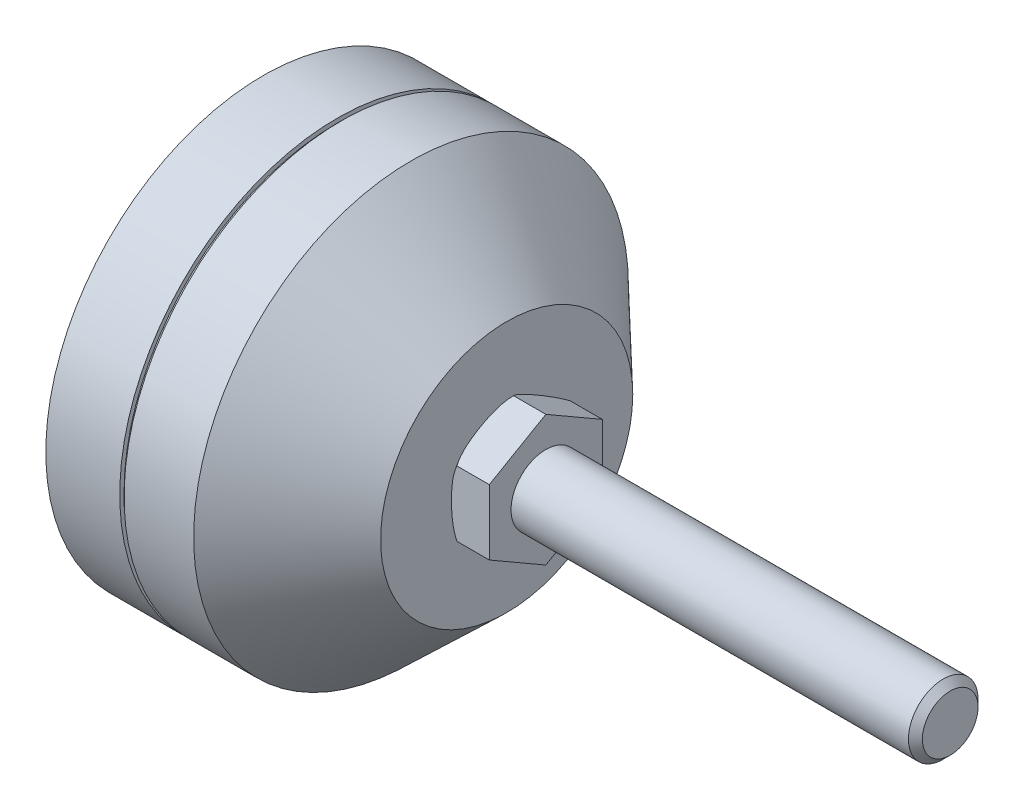
ISO-10303-21;
HEADER;
FILE_DESCRIPTION(('STEP AP214'),'2;1');
FILE_NAME('part.step','',(''),(''),'','','');
FILE_SCHEMA(('AUTOMOTIVE_DESIGN { 1 0 10303 214 1 1 1 1 }'));
ENDSEC;
DATA;
#1=APPLICATION_CONTEXT('core data for automotive mechanical design processes');
#2=APPLICATION_PROTOCOL_DEFINITION('international standard','automotive_design',2000,#1);
#3=PRODUCT_CONTEXT('',#1,'mechanical');
#4=PRODUCT('Part','Part','',(#3));
#5=PRODUCT_RELATED_PRODUCT_CATEGORY('part','',(#4));
#6=PRODUCT_DEFINITION_FORMATION('','',#4);
#7=PRODUCT_DEFINITION_CONTEXT('part definition',#1,'design');
#8=PRODUCT_DEFINITION('design','',#6,#7);
#9=PRODUCT_DEFINITION_SHAPE('','',#8);
#10=(LENGTH_UNIT() NAMED_UNIT(*) SI_UNIT(.MILLI.,.METRE.));
#11=(NAMED_UNIT(*) PLANE_ANGLE_UNIT() SI_UNIT($,.RADIAN.));
#12=(NAMED_UNIT(*) SI_UNIT($,.STERADIAN.) SOLID_ANGLE_UNIT());
#13=UNCERTAINTY_MEASURE_WITH_UNIT(LENGTH_MEASURE(1.E-05),#10,'distance_accuracy_value','');
#14=(GEOMETRIC_REPRESENTATION_CONTEXT(3) GLOBAL_UNCERTAINTY_ASSIGNED_CONTEXT((#13)) GLOBAL_UNIT_ASSIGNED_CONTEXT((#10,
#11,#12)) REPRESENTATION_CONTEXT('',''));
#15=CARTESIAN_POINT('',(0.,0.,0.));
#16=DIRECTION('',(0.,0.,1.));
#17=DIRECTION('',(1.,0.,0.));
#18=AXIS2_PLACEMENT_3D('',#15,#16,#17);
#19=CARTESIAN_POINT('',(82.5,0.,0.));
#20=DIRECTION('',(1.,0.,0.));
#21=DIRECTION('',(0.,0.,-1.));
#22=AXIS2_PLACEMENT_3D('',#19,#20,#21);
#23=CYLINDRICAL_SURFACE('',#22,4.);
#24=CARTESIAN_POINT('',(78.2,0.,0.));
#25=DIRECTION('',(1.,0.,0.));
#26=DIRECTION('',(0.,0.,-1.));
#27=AXIS2_PLACEMENT_3D('',#24,#25,#26);
#28=CIRCLE('',#27,4.);
#29=CARTESIAN_POINT('',(78.2,0.,-4.));
#30=VERTEX_POINT('',#29);
#31=EDGE_CURVE('E11',#30,#30,#28,.F.);
#32=ORIENTED_EDGE('',*,*,#31,.T.);
#33=EDGE_LOOP('',(#32));
#34=FACE_BOUND('',#33,.T.);
#35=CARTESIAN_POINT('',(32.5,0.,0.));
#36=DIRECTION('',(1.,0.,0.));
#37=DIRECTION('',(0.,0.,-1.));
#38=AXIS2_PLACEMENT_3D('',#35,#36,#37);
#39=CIRCLE('',#38,4.);
#40=CARTESIAN_POINT('',(32.5,0.,-4.));
#41=VERTEX_POINT('',#40);
#42=EDGE_CURVE('E279',#41,#41,#39,.T.);
#43=ORIENTED_EDGE('',*,*,#42,.T.);
#44=EDGE_LOOP('',(#43));
#45=FACE_BOUND('',#44,.T.);
#46=ADVANCED_FACE('F40',(#34,#45),#23,.T.);
#47=CARTESIAN_POINT('',(0.,0.,0.));
#48=DIRECTION('',(1.,0.,0.));
#49=DIRECTION('',(0.,0.,-1.));
#50=AXIS2_PLACEMENT_3D('',#47,#48,#49);
#51=PLANE('',#50);
#52=CARTESIAN_POINT('',(0.,0.,0.));
#53=DIRECTION('',(1.,0.,0.));
#54=DIRECTION('',(0.,0.,-1.));
#55=AXIS2_PLACEMENT_3D('',#52,#53,#54);
#56=CIRCLE('',#55,25.);
#57=CARTESIAN_POINT('',(0.,0.,-25.));
#58=VERTEX_POINT('',#57);
#59=EDGE_CURVE('E335',#58,#58,#56,.T.);
#60=ORIENTED_EDGE('',*,*,#59,.F.);
#61=EDGE_LOOP('',(#60));
#62=FACE_BOUND('',#61,.T.);
#63=ADVANCED_FACE('F267',(#62),#51,.F.);
#64=CARTESIAN_POINT('',(82.5,0.,0.));
#65=DIRECTION('',(1.,0.,0.));
#66=DIRECTION('',(0.,0.,-1.));
#67=AXIS2_PLACEMENT_3D('',#64,#65,#66);
#68=CYLINDRICAL_SURFACE('',#67,25.);
#69=CARTESIAN_POINT('',(8.5,0.,0.));
#70=DIRECTION('',(1.,0.,0.));
#71=DIRECTION('',(0.,0.,-1.));
#72=AXIS2_PLACEMENT_3D('',#69,#70,#71);
#73=CIRCLE('',#72,25.);
#74=CARTESIAN_POINT('',(8.5,0.,-25.));
#75=VERTEX_POINT('',#74);
#76=EDGE_CURVE('E332',#75,#75,#73,.T.);
#77=ORIENTED_EDGE('',*,*,#76,.F.);
#78=EDGE_LOOP('',(#77));
#79=FACE_BOUND('',#78,.T.);
#80=ORIENTED_EDGE('',*,*,#59,.T.);
#81=EDGE_LOOP('',(#80));
#82=FACE_BOUND('',#81,.T.);
#83=ADVANCED_FACE('F272',(#79,#82),#68,.T.);
#84=CARTESIAN_POINT('',(8.5,25.,0.));
#85=DIRECTION('',(-1.,0.,0.));
#86=DIRECTION('',(0.,0.,1.));
#87=AXIS2_PLACEMENT_3D('',#84,#85,#86);
#88=PLANE('',#87);
#89=CARTESIAN_POINT('',(8.5,0.,0.));
#90=DIRECTION('',(1.,0.,0.));
#91=DIRECTION('',(0.,0.,-1.));
#92=AXIS2_PLACEMENT_3D('',#89,#90,#91);
#93=CIRCLE('',#92,24.5);
#94=CARTESIAN_POINT('',(8.5,0.,-24.5));
#95=VERTEX_POINT('',#94);
#96=EDGE_CURVE('E327',#95,#95,#93,.T.);
#97=ORIENTED_EDGE('',*,*,#96,.F.);
#98=EDGE_LOOP('',(#97));
#99=FACE_BOUND('',#98,.T.);
#100=ORIENTED_EDGE('',*,*,#76,.T.);
#101=EDGE_LOOP('',(#100));
#102=FACE_BOUND('',#101,.T.);
#103=ADVANCED_FACE('F298',(#99,#102),#88,.F.);
#104=CARTESIAN_POINT('',(8.5,0.,0.));
#105=DIRECTION('',(1.,0.,0.));
#106=DIRECTION('',(0.,0.,-1.));
#107=AXIS2_PLACEMENT_3D('',#104,#105,#106);
#108=CONICAL_SURFACE('',#107,24.5,0.785398163397448);
#109=CARTESIAN_POINT('',(9.,0.,0.));
#110=DIRECTION('',(1.,0.,0.));
#111=DIRECTION('',(0.,0.,-1.));
#112=AXIS2_PLACEMENT_3D('',#109,#110,#111);
#113=CIRCLE('',#112,25.);
#114=CARTESIAN_POINT('',(9.,0.,-25.));
#115=VERTEX_POINT('',#114);
#116=EDGE_CURVE('E324',#115,#115,#113,.T.);
#117=ORIENTED_EDGE('',*,*,#116,.F.);
#118=EDGE_LOOP('',(#117));
#119=FACE_BOUND('',#118,.T.);
#120=ORIENTED_EDGE('',*,*,#96,.T.);
#121=EDGE_LOOP('',(#120));
#122=FACE_BOUND('',#121,.T.);
#123=ADVANCED_FACE('F302',(#119,#122),#108,.T.);
#124=CARTESIAN_POINT('',(82.5,0.,0.));
#125=DIRECTION('',(1.,0.,0.));
#126=DIRECTION('',(0.,0.,-1.));
#127=AXIS2_PLACEMENT_3D('',#124,#125,#126);
#128=CYLINDRICAL_SURFACE('',#127,25.);
#129=CARTESIAN_POINT('',(17.,0.,0.));
#130=DIRECTION('',(1.,0.,0.));
#131=DIRECTION('',(0.,0.,-1.));
#132=AXIS2_PLACEMENT_3D('',#129,#130,#131);
#133=CIRCLE('',#132,25.);
#134=CARTESIAN_POINT('',(17.,0.,-25.));
#135=VERTEX_POINT('',#134);
#136=EDGE_CURVE('E323',#135,#135,#133,.T.);
#137=ORIENTED_EDGE('',*,*,#136,.F.);
#138=EDGE_LOOP('',(#137));
#139=FACE_BOUND('',#138,.T.);
#140=ORIENTED_EDGE('',*,*,#116,.T.);
#141=EDGE_LOOP('',(#140));
#142=FACE_BOUND('',#141,.T.);
#143=ADVANCED_FACE('F306',(#139,#142),#128,.T.);
#144=CARTESIAN_POINT('',(17.,0.,0.));
#145=DIRECTION('',(-1.,0.,0.));
#146=DIRECTION('',(0.,0.,1.));
#147=AXIS2_PLACEMENT_3D('',#144,#145,#146);
#148=CONICAL_SURFACE('',#147,25.,0.762146540586986);
#149=CARTESIAN_POINT('',(28.,0.,0.));
#150=DIRECTION('',(1.,0.,0.));
#151=DIRECTION('',(0.,0.,-1.));
#152=AXIS2_PLACEMENT_3D('',#149,#150,#151);
#153=CIRCLE('',#152,14.5);
#154=CARTESIAN_POINT('',(28.,0.,-14.5));
#155=VERTEX_POINT('',#154);
#156=EDGE_CURVE('E320',#155,#155,#153,.T.);
#157=ORIENTED_EDGE('',*,*,#156,.F.);
#158=EDGE_LOOP('',(#157));
#159=FACE_BOUND('',#158,.T.);
#160=ORIENTED_EDGE('',*,*,#136,.T.);
#161=EDGE_LOOP('',(#160));
#162=FACE_BOUND('',#161,.T.);
#163=ADVANCED_FACE('F309',(#159,#162),#148,.T.);
#164=CARTESIAN_POINT('',(28.,14.5,0.));
#165=DIRECTION('',(-1.,0.,0.));
#166=DIRECTION('',(0.,0.,1.));
#167=AXIS2_PLACEMENT_3D('',#164,#165,#166);
#168=PLANE('',#167);
#169=ORIENTED_EDGE('',*,*,#156,.T.);
#170=EDGE_LOOP('',(#169));
#171=FACE_BOUND('',#170,.T.);
#172=CARTESIAN_POINT('',(28.,0.,0.));
#173=DIRECTION('',(1.,0.,0.));
#174=DIRECTION('',(0.,0.,-1.));
#175=AXIS2_PLACEMENT_3D('',#172,#173,#174);
#176=CIRCLE('',#175,5.60555349946541);
#177=CARTESIAN_POINT('',(28.,0.,-5.60555349946541));
#178=VERTEX_POINT('',#177);
#179=EDGE_CURVE('E125',#178,#178,#176,.T.);
#180=ORIENTED_EDGE('',*,*,#179,.F.);
#181=EDGE_LOOP('',(#180));
#182=FACE_BOUND('',#181,.T.);
#183=ADVANCED_FACE('F142',(#171,#182),#168,.F.);
#184=CARTESIAN_POINT('',(30.7,0.,0.));
#185=DIRECTION('',(1.,0.,0.));
#186=DIRECTION('',(0.,0.,-1.));
#187=AXIS2_PLACEMENT_3D('',#184,#185,#186);
#188=TOROIDAL_SURFACE('',#187,5.60555349946541,2.69999999999974);
#189=CARTESIAN_POINT('',(28.7816674450426,3.75277685951686,6.5));
#190=CARTESIAN_POINT('',(28.7613545278986,3.71175904029286,6.5));
#191=CARTESIAN_POINT('',(28.7417539007523,3.67035741039875,6.5));
#192=CARTESIAN_POINT('',(28.7039915048998,3.58705736290951,6.5));
#193=CARTESIAN_POINT('',(28.6858352829872,3.54517733250758,6.5));
#194=CARTESIAN_POINT('',(28.63327929734,3.41860983722914,6.5));
#195=CARTESIAN_POINT('',(28.600971803585,3.33346306761934,6.5));
#196=CARTESIAN_POINT('',(28.5105655211857,3.07403120749082,6.5));
#197=CARTESIAN_POINT('',(28.4595937961399,2.89732223239918,6.5));
#198=CARTESIAN_POINT('',(28.3079349733705,2.27414781575982,6.5));
#199=CARTESIAN_POINT('',(28.2458895561874,1.82220529830996,6.5));
#200=CARTESIAN_POINT('',(28.1679872087156,0.911927722176328,6.5));
#201=CARTESIAN_POINT('',(28.1524589389609,0.457069886751857,6.5));
#202=CARTESIAN_POINT('',(28.1524589389609,-0.458499142986258,6.5));
#203=CARTESIAN_POINT('',(28.1681578360931,-0.917399136468803,6.5));
#204=CARTESIAN_POINT('',(28.2471269494985,-1.8331236365492,6.5));
#205=CARTESIAN_POINT('',(28.3098223557404,-2.28677187643626,6.5));
#206=CARTESIAN_POINT('',(28.5036410563009,-3.07447273530205,6.5));
#207=CARTESIAN_POINT('',(28.6137512031566,-3.40655164008468,6.5));
#208=CARTESIAN_POINT('',(28.7717046695275,-3.73254867409801,6.5));
#209=CARTESIAN_POINT('',(28.7766634533395,-3.74267231816483,6.5));
#210=CARTESIAN_POINT('',(28.7816678323669,-3.75277764164144,6.5));
#211=B_SPLINE_CURVE_WITH_KNOTS('',3,(#189,#190,#191,#192,#193,#194,#195,#196,#197,#198,#199,
#200,#201,#202,#203,#204,#205,#206,#207,#208,#209,#210),.UNSPECIFIED.,.F.,.F.,(4,2,2,2,2,2,2,2,
2,2,4),(21.4653656359153,21.6026109807731,21.7398563256309,22.0143470153464,22.5633283947775,
23.9330925625883,25.302856730399,26.6769041468622,28.0509515633255,29.091452340955,
29.1248943163273),.UNSPECIFIED.);
#212=CARTESIAN_POINT('',(28.7816673906747,3.7527767497326,6.5));
#213=VERTEX_POINT('',#212);
#214=CARTESIAN_POINT('',(28.781667390669,-3.75277674973837,6.49999999999001));
#215=VERTEX_POINT('',#214);
#216=EDGE_CURVE('E106',#213,#215,#211,.T.);
#217=ORIENTED_EDGE('',*,*,#216,.F.);
#218=CARTESIAN_POINT('',(28.7816673906303,7.50555349942004,7.80483840869606E-11));
#219=CARTESIAN_POINT('',(28.6500000242734,7.37261570863953,0.230255007955859));
#220=CARTESIAN_POINT('',(28.5495394527387,7.23367972610888,0.470899188698446));
#221=CARTESIAN_POINT('',(28.3899088735364,6.94854209425677,0.964772054216187));
#222=CARTESIAN_POINT('',(28.3317245218498,6.80386007270674,1.21536866648261));
#223=CARTESIAN_POINT('',(28.2272841292935,6.45942405400656,1.81194935082807));
#224=CARTESIAN_POINT('',(28.192842401115,6.25912814591938,2.15887204018323));
#225=CARTESIAN_POINT('',(28.1534269828326,5.86070667979887,2.84895826233005));
#226=CARTESIAN_POINT('',(28.1482810226136,5.66319688036159,3.19105526994816));
#227=CARTESIAN_POINT('',(28.1625000688476,5.26642124330331,3.87829083253862));
#228=CARTESIAN_POINT('',(28.1816910205527,5.06977429845133,4.21889333217546));
#229=CARTESIAN_POINT('',(28.2595232654608,4.67240021666049,4.90716543144823));
#230=CARTESIAN_POINT('',(28.317917633634,4.47367769709478,5.25136293194416));
#231=CARTESIAN_POINT('',(28.4993513221206,4.0969731461065,5.90383435369829));
#232=CARTESIAN_POINT('',(28.6159334847767,3.92010977929166,6.21017069101929));
#233=CARTESIAN_POINT('',(28.7816673906609,3.75277674974683,6.49999999997536));
#234=B_SPLINE_CURVE_WITH_KNOTS('',3,(#218,#219,#220,#221,#222,#223,#224,#225,#226,#227,#228,
#229,#230,#231,#232,#233),.UNSPECIFIED.,.F.,.F.,(4,2,2,2,2,2,2,4),(0.000253721511004251,
0.88333285403746,1.76641198656391,2.96517631044045,4.16394063431699,5.36270495819352,
6.56146928207006,7.66229512899537),.UNSPECIFIED.);
#235=CARTESIAN_POINT('',(28.7816673906747,7.5055534994651,0.));
#236=VERTEX_POINT('',#235);
#237=EDGE_CURVE('E93',#236,#213,#234,.T.);
#238=ORIENTED_EDGE('',*,*,#237,.F.);
#239=CARTESIAN_POINT('',(28.7816673906294,3.75277674977863,-6.49999999992027));
#240=CARTESIAN_POINT('',(28.6500000242727,3.88571454055912,-6.2697449920425));
#241=CARTESIAN_POINT('',(28.5495394527382,4.02465052308972,-6.0291008113));
#242=CARTESIAN_POINT('',(28.389908873536,4.30978815494173,-5.53522794578243));
#243=CARTESIAN_POINT('',(28.3317245218495,4.4544701764917,-5.2846313335161));
#244=CARTESIAN_POINT('',(28.2272841292934,4.79890619519181,-4.68805064917076));
#245=CARTESIAN_POINT('',(28.1928424011149,4.99920210327898,-4.34112795981564));
#246=CARTESIAN_POINT('',(28.1534269828325,5.39762356939945,-3.65104173766888));
#247=CARTESIAN_POINT('',(28.1482810226136,5.59513336883671,-3.3089447300508));
#248=CARTESIAN_POINT('',(28.1625000688476,5.99190900589495,-2.6217091674604));
#249=CARTESIAN_POINT('',(28.1816910205527,6.18855595074692,-2.2811066678236));
#250=CARTESIAN_POINT('',(28.2595232654609,6.58593003253772,-1.59283456855088));
#251=CARTESIAN_POINT('',(28.3179176336341,6.78465255210341,-1.248637068055));
#252=CARTESIAN_POINT('',(28.4993513221208,7.16135710309151,-0.59616564630118));
#253=CARTESIAN_POINT('',(28.6159334847768,7.33822046990619,-0.289829308980458));
#254=CARTESIAN_POINT('',(28.7816673906609,7.50555349945088,-2.46313386353947E-11));
#255=B_SPLINE_CURVE_WITH_KNOTS('',3,(#239,#240,#241,#242,#243,#244,#245,#246,#247,#248,#249,
#250,#251,#252,#253,#254),.UNSPECIFIED.,.F.,.F.,(4,2,2,2,2,2,2,4),(0.000253721512318145,
0.883332854038403,1.76641198656449,2.96517631044091,4.16394063431733,5.36270495819375,
6.56146928207017,7.66229512899453),.UNSPECIFIED.);
#256=CARTESIAN_POINT('',(28.7816673906671,3.7527767497326,-6.5));
#257=VERTEX_POINT('',#256);
#258=EDGE_CURVE('E105',#257,#236,#255,.T.);
#259=ORIENTED_EDGE('',*,*,#258,.F.);
#260=CARTESIAN_POINT('',(28.7816674450426,-3.75277685951685,-6.5));
#261=CARTESIAN_POINT('',(28.7613545278986,-3.71175904029286,-6.5));
#262=CARTESIAN_POINT('',(28.7417539007523,-3.67035741039874,-6.5));
#263=CARTESIAN_POINT('',(28.7039915048998,-3.5870573629095,-6.5));
#264=CARTESIAN_POINT('',(28.6858352829872,-3.54517733250758,-6.5));
#265=CARTESIAN_POINT('',(28.63327929734,-3.41860983722914,-6.5));
#266=CARTESIAN_POINT('',(28.600971803585,-3.33346306761933,-6.5));
#267=CARTESIAN_POINT('',(28.5105655211857,-3.07403120749082,-6.5));
#268=CARTESIAN_POINT('',(28.4595937961399,-2.89732223239918,-6.5));
#269=CARTESIAN_POINT('',(28.3079349733705,-2.27414781575982,-6.5));
#270=CARTESIAN_POINT('',(28.2458895561874,-1.82220529830995,-6.5));
#271=CARTESIAN_POINT('',(28.1679872087156,-0.911927722176327,-6.5));
#272=CARTESIAN_POINT('',(28.1524589389609,-0.457069886751856,-6.5));
#273=CARTESIAN_POINT('',(28.1524589389609,0.45849914298626,-6.5));
#274=CARTESIAN_POINT('',(28.1681578360931,0.917399136468807,-6.5));
#275=CARTESIAN_POINT('',(28.2471269494985,1.8331236365492,-6.5));
#276=CARTESIAN_POINT('',(28.3098223557404,2.28677187643626,-6.5));
#277=CARTESIAN_POINT('',(28.5036410563009,3.07447273530205,-6.5));
#278=CARTESIAN_POINT('',(28.6137512031566,3.40655164008466,-6.5));
#279=CARTESIAN_POINT('',(28.7717046695267,3.73254867409625,-6.5));
#280=CARTESIAN_POINT('',(28.7766634533378,3.74267231816131,-6.5));
#281=CARTESIAN_POINT('',(28.7816678323643,3.75277764163617,-6.5));
#282=B_SPLINE_CURVE_WITH_KNOTS('',3,(#260,#261,#262,#263,#264,#265,#266,#267,#268,#269,#270,
#271,#272,#273,#274,#275,#276,#277,#278,#279,#280,#281),.UNSPECIFIED.,.F.,.F.,(4,2,2,2,2,2,2,2,
2,2,4),(21.4653656359153,21.6026109807731,21.7398563256309,22.0143470153464,22.5633283947775,
23.9330925625882,25.302856730399,26.6769041468622,28.0509515633254,29.0914523409549,
29.1248943163214),.UNSPECIFIED.);
#283=CARTESIAN_POINT('',(28.7816673906747,-3.7527767497326,-6.5));
#284=VERTEX_POINT('',#283);
#285=EDGE_CURVE('E172',#284,#257,#282,.T.);
#286=ORIENTED_EDGE('',*,*,#285,.F.);
#287=CARTESIAN_POINT('',(28.7816673906303,-7.50555349942004,-7.8048175453727E-11));
#288=CARTESIAN_POINT('',(28.6500000242734,-7.37261570863953,-0.230255007955857));
#289=CARTESIAN_POINT('',(28.5495394527387,-7.23367972610888,-0.470899188698439));
#290=CARTESIAN_POINT('',(28.3899088735364,-6.94854209425677,-0.964772054216182));
#291=CARTESIAN_POINT('',(28.3317245218498,-6.80386007270674,-1.21536866648261));
#292=CARTESIAN_POINT('',(28.2272841292935,-6.45942405400656,-1.81194935082807));
#293=CARTESIAN_POINT('',(28.192842401115,-6.25912814591938,-2.15887204018323));
#294=CARTESIAN_POINT('',(28.1534269828326,-5.86070667979887,-2.84895826233005));
#295=CARTESIAN_POINT('',(28.1482810226136,-5.66319688036159,-3.19105526994816));
#296=CARTESIAN_POINT('',(28.1625000688476,-5.26642124330331,-3.87829083253862));
#297=CARTESIAN_POINT('',(28.1816910205527,-5.06977429845133,-4.21889333217546));
#298=CARTESIAN_POINT('',(28.2595232654608,-4.67240021666049,-4.90716543144823));
#299=CARTESIAN_POINT('',(28.317917633634,-4.47367769709478,-5.25136293194416));
#300=CARTESIAN_POINT('',(28.4993513221206,-4.0969731461065,-5.90383435369829));
#301=CARTESIAN_POINT('',(28.6159334847767,-3.92010977929166,-6.21017069101929));
#302=CARTESIAN_POINT('',(28.7816673906609,-3.75277674974683,-6.49999999997536));
#303=B_SPLINE_CURVE_WITH_KNOTS('',3,(#287,#288,#289,#290,#291,#292,#293,#294,#295,#296,#297,
#298,#299,#300,#301,#302),.UNSPECIFIED.,.F.,.F.,(4,2,2,2,2,2,2,4),(0.000253721511004251,
0.88333285403746,1.76641198656391,2.96517631044045,4.16394063431699,5.36270495819352,
6.56146928207006,7.66229512899537),.UNSPECIFIED.);
#304=CARTESIAN_POINT('',(28.7816673906747,-7.5055534994651,0.));
#305=VERTEX_POINT('',#304);
#306=EDGE_CURVE('E173',#305,#284,#303,.T.);
#307=ORIENTED_EDGE('',*,*,#306,.F.);
#308=CARTESIAN_POINT('',(28.7816673906247,-3.75277674978343,6.49999999991196));
#309=CARTESIAN_POINT('',(28.6500000242695,-3.88571454056327,6.26974499203531));
#310=CARTESIAN_POINT('',(28.549539452736,-4.02465052309308,6.02910081129417));
#311=CARTESIAN_POINT('',(28.3899088735354,-4.30978815494343,5.53522794577948));
#312=CARTESIAN_POINT('',(28.3317245218493,-4.45447017649257,5.28463133351459));
#313=CARTESIAN_POINT('',(28.2272841292934,-4.79890619519181,4.68805064917076));
#314=CARTESIAN_POINT('',(28.1928424011149,-4.99920210327897,4.34112795981564));
#315=CARTESIAN_POINT('',(28.1534269828325,-5.39762356939945,3.65104173766888));
#316=CARTESIAN_POINT('',(28.1482810226136,-5.59513336883671,3.3089447300508));
#317=CARTESIAN_POINT('',(28.1625000688476,-5.99190900589495,2.6217091674604));
#318=CARTESIAN_POINT('',(28.1816910205527,-6.18855595074691,2.28110666782361));
#319=CARTESIAN_POINT('',(28.2595232654609,-6.58593003253771,1.5928345685509));
#320=CARTESIAN_POINT('',(28.3179176336341,-6.78465255210341,1.248637068055));
#321=CARTESIAN_POINT('',(28.4993513221208,-7.16135710309151,0.596165646301182));
#322=CARTESIAN_POINT('',(28.6159334847768,-7.33822046990619,0.28982930898046));
#323=CARTESIAN_POINT('',(28.7816673906609,-7.50555349945087,2.46330733588707E-11));
#324=B_SPLINE_CURVE_WITH_KNOTS('',3,(#308,#309,#310,#311,#312,#313,#314,#315,#316,#317,#318,
#319,#320,#321,#322,#323),.UNSPECIFIED.,.F.,.F.,(4,2,2,2,2,2,2,4),(0.000253721522861253,
0.883332854043675,1.76641198656449,2.96517631044091,4.16394063431733,5.36270495819375,
6.56146928207017,7.66229512899453),.UNSPECIFIED.);
#325=EDGE_CURVE('E123',#215,#305,#324,.T.);
#326=ORIENTED_EDGE('',*,*,#325,.F.);
#327=EDGE_LOOP('',(#217,#238,#259,#286,#307,#326));
#328=FACE_BOUND('',#327,.T.);
#329=ORIENTED_EDGE('',*,*,#179,.T.);
#330=EDGE_LOOP('',(#329));
#331=FACE_BOUND('',#330,.T.);
#332=ADVANCED_FACE('F120',(#328,#331),#188,.T.);
#333=CARTESIAN_POINT('',(32.5,3.7527767497326,6.5));
#334=DIRECTION('',(0.,0.,-1.));
#335=DIRECTION('',(-1.,0.,0.));
#336=AXIS2_PLACEMENT_3D('',#333,#334,#335);
#337=PLANE('',#336);
#338=ORIENTED_EDGE('',*,*,#216,.T.);
#339=DIRECTION('',(-1.,0.,0.));
#340=VECTOR('',#339,1.);
#341=CARTESIAN_POINT('',(32.5,-3.7527767497326,6.5));
#342=LINE('',#341,#340);
#343=CARTESIAN_POINT('',(32.5,-3.7527767497326,6.5));
#344=VERTEX_POINT('',#343);
#345=EDGE_CURVE('E511',#344,#215,#342,.T.);
#346=ORIENTED_EDGE('',*,*,#345,.F.);
#347=DIRECTION('',(0.,-1.,0.));
#348=VECTOR('',#347,1.);
#349=CARTESIAN_POINT('',(32.5,3.7527767497326,6.5));
#350=LINE('',#349,#348);
#351=CARTESIAN_POINT('',(32.5,3.7527767497326,6.5));
#352=VERTEX_POINT('',#351);
#353=EDGE_CURVE('E115',#352,#344,#350,.T.);
#354=ORIENTED_EDGE('',*,*,#353,.F.);
#355=DIRECTION('',(-1.,0.,0.));
#356=VECTOR('',#355,1.);
#357=CARTESIAN_POINT('',(32.5,3.7527767497326,6.5));
#358=LINE('',#357,#356);
#359=EDGE_CURVE('E98',#352,#213,#358,.T.);
#360=ORIENTED_EDGE('',*,*,#359,.T.);
#361=EDGE_LOOP('',(#338,#346,#354,#360));
#362=FACE_BOUND('',#361,.T.);
#363=ADVANCED_FACE('F112',(#362),#337,.F.);
#364=CARTESIAN_POINT('',(32.5,7.5055534994651,0.));
#365=DIRECTION('',(0.,-0.866025403784443,-0.499999999999993));
#366=DIRECTION('',(0.,0.499999999999993,-0.866025403784443));
#367=AXIS2_PLACEMENT_3D('',#364,#365,#366);
#368=PLANE('',#367);
#369=ORIENTED_EDGE('',*,*,#237,.T.);
#370=ORIENTED_EDGE('',*,*,#359,.F.);
#371=DIRECTION('',(0.,-0.499999999999993,0.866025403784443));
#372=VECTOR('',#371,1.);
#373=CARTESIAN_POINT('',(32.5,7.5055534994651,0.));
#374=LINE('',#373,#372);
#375=CARTESIAN_POINT('',(32.5,7.5055534994651,0.));
#376=VERTEX_POINT('',#375);
#377=EDGE_CURVE('E116',#376,#352,#374,.T.);
#378=ORIENTED_EDGE('',*,*,#377,.F.);
#379=DIRECTION('',(-1.,0.,0.));
#380=VECTOR('',#379,1.);
#381=CARTESIAN_POINT('',(32.5,7.5055534994651,0.));
#382=LINE('',#381,#380);
#383=EDGE_CURVE('E100',#376,#236,#382,.T.);
#384=ORIENTED_EDGE('',*,*,#383,.T.);
#385=EDGE_LOOP('',(#369,#370,#378,#384));
#386=FACE_BOUND('',#385,.T.);
#387=ADVANCED_FACE('F96',(#386),#368,.F.);
#388=CARTESIAN_POINT('',(32.5,3.7527767497326,-6.5));
#389=DIRECTION('',(0.,-0.866025403784443,0.499999999999993));
#390=DIRECTION('',(0.,-0.499999999999993,-0.866025403784443));
#391=AXIS2_PLACEMENT_3D('',#388,#389,#390);
#392=PLANE('',#391);
#393=ORIENTED_EDGE('',*,*,#258,.T.);
#394=ORIENTED_EDGE('',*,*,#383,.F.);
#395=DIRECTION('',(0.,0.499999999999993,0.866025403784443));
#396=VECTOR('',#395,1.);
#397=CARTESIAN_POINT('',(32.5,3.7527767497326,-6.5));
#398=LINE('',#397,#396);
#399=CARTESIAN_POINT('',(32.5,3.7527767497326,-6.5));
#400=VERTEX_POINT('',#399);
#401=EDGE_CURVE('E192',#400,#376,#398,.T.);
#402=ORIENTED_EDGE('',*,*,#401,.F.);
#403=DIRECTION('',(-1.,0.,0.));
#404=VECTOR('',#403,1.);
#405=CARTESIAN_POINT('',(32.5,3.7527767497326,-6.5));
#406=LINE('',#405,#404);
#407=EDGE_CURVE('E183',#400,#257,#406,.T.);
#408=ORIENTED_EDGE('',*,*,#407,.T.);
#409=EDGE_LOOP('',(#393,#394,#402,#408));
#410=FACE_BOUND('',#409,.T.);
#411=ADVANCED_FACE('F181',(#410),#392,.F.);
#412=CARTESIAN_POINT('',(32.5,-3.7527767497326,-6.5));
#413=DIRECTION('',(0.,0.,1.));
#414=DIRECTION('',(1.,0.,0.));
#415=AXIS2_PLACEMENT_3D('',#412,#413,#414);
#416=PLANE('',#415);
#417=ORIENTED_EDGE('',*,*,#285,.T.);
#418=ORIENTED_EDGE('',*,*,#407,.F.);
#419=DIRECTION('',(0.,1.,0.));
#420=VECTOR('',#419,1.);
#421=CARTESIAN_POINT('',(32.5,-3.7527767497326,-6.5));
#422=LINE('',#421,#420);
#423=CARTESIAN_POINT('',(32.5,-3.7527767497326,-6.5));
#424=VERTEX_POINT('',#423);
#425=EDGE_CURVE('E215',#424,#400,#422,.T.);
#426=ORIENTED_EDGE('',*,*,#425,.F.);
#427=DIRECTION('',(-1.,0.,0.));
#428=VECTOR('',#427,1.);
#429=CARTESIAN_POINT('',(32.5,-3.7527767497326,-6.5));
#430=LINE('',#429,#428);
#431=EDGE_CURVE('E222',#424,#284,#430,.T.);
#432=ORIENTED_EDGE('',*,*,#431,.T.);
#433=EDGE_LOOP('',(#417,#418,#426,#432));
#434=FACE_BOUND('',#433,.T.);
#435=ADVANCED_FACE('F202',(#434),#416,.F.);
#436=CARTESIAN_POINT('',(32.5,-7.5055534994651,0.));
#437=DIRECTION('',(0.,0.866025403784443,0.499999999999993));
#438=DIRECTION('',(0.,-0.499999999999993,0.866025403784443));
#439=AXIS2_PLACEMENT_3D('',#436,#437,#438);
#440=PLANE('',#439);
#441=ORIENTED_EDGE('',*,*,#306,.T.);
#442=ORIENTED_EDGE('',*,*,#431,.F.);
#443=DIRECTION('',(0.,0.499999999999993,-0.866025403784443));
#444=VECTOR('',#443,1.);
#445=CARTESIAN_POINT('',(32.5,-7.5055534994651,0.));
#446=LINE('',#445,#444);
#447=CARTESIAN_POINT('',(32.5,-7.5055534994651,0.));
#448=VERTEX_POINT('',#447);
#449=EDGE_CURVE('E60',#448,#424,#446,.T.);
#450=ORIENTED_EDGE('',*,*,#449,.F.);
#451=DIRECTION('',(-1.,0.,0.));
#452=VECTOR('',#451,1.);
#453=CARTESIAN_POINT('',(32.5,-7.5055534994651,0.));
#454=LINE('',#453,#452);
#455=EDGE_CURVE('E241',#448,#305,#454,.T.);
#456=ORIENTED_EDGE('',*,*,#455,.T.);
#457=EDGE_LOOP('',(#441,#442,#450,#456));
#458=FACE_BOUND('',#457,.T.);
#459=ADVANCED_FACE('F207',(#458),#440,.F.);
#460=CARTESIAN_POINT('',(32.5,-3.7527767497326,6.5));
#461=DIRECTION('',(0.,0.866025403784443,-0.499999999999993));
#462=DIRECTION('',(0.,0.499999999999993,0.866025403784443));
#463=AXIS2_PLACEMENT_3D('',#460,#461,#462);
#464=PLANE('',#463);
#465=ORIENTED_EDGE('',*,*,#325,.T.);
#466=ORIENTED_EDGE('',*,*,#455,.F.);
#467=DIRECTION('',(0.,-0.499999999999993,-0.866025403784443));
#468=VECTOR('',#467,1.);
#469=CARTESIAN_POINT('',(32.5,-3.7527767497326,6.5));
#470=LINE('',#469,#468);
#471=EDGE_CURVE('E56',#344,#448,#470,.T.);
#472=ORIENTED_EDGE('',*,*,#471,.F.);
#473=ORIENTED_EDGE('',*,*,#345,.T.);
#474=EDGE_LOOP('',(#465,#466,#472,#473));
#475=FACE_BOUND('',#474,.T.);
#476=ADVANCED_FACE('F254',(#475),#464,.F.);
#477=CARTESIAN_POINT('',(32.5,8.,0.));
#478=DIRECTION('',(-1.,0.,0.));
#479=DIRECTION('',(0.,0.,1.));
#480=AXIS2_PLACEMENT_3D('',#477,#478,#479);
#481=PLANE('',#480);
#482=ORIENTED_EDGE('',*,*,#377,.T.);
#483=ORIENTED_EDGE('',*,*,#353,.T.);
#484=ORIENTED_EDGE('',*,*,#471,.T.);
#485=ORIENTED_EDGE('',*,*,#449,.T.);
#486=ORIENTED_EDGE('',*,*,#425,.T.);
#487=ORIENTED_EDGE('',*,*,#401,.T.);
#488=EDGE_LOOP('',(#482,#483,#484,#485,#486,#487));
#489=FACE_BOUND('',#488,.T.);
#490=ORIENTED_EDGE('',*,*,#42,.F.);
#491=EDGE_LOOP('',(#490));
#492=FACE_BOUND('',#491,.T.);
#493=ADVANCED_FACE('F263',(#489,#492),#481,.F.);
#494=CARTESIAN_POINT('',(79.,0.,0.));
#495=DIRECTION('',(1.,0.,0.));
#496=DIRECTION('',(0.,0.,-1.));
#497=AXIS2_PLACEMENT_3D('',#494,#495,#496);
#498=PLANE('',#497);
#499=CARTESIAN_POINT('',(79.,0.,0.));
#500=DIRECTION('',(1.,0.,0.));
#501=DIRECTION('',(0.,0.,-1.));
#502=AXIS2_PLACEMENT_3D('',#499,#500,#501);
#503=CIRCLE('',#502,3.20000000000001);
#504=CARTESIAN_POINT('',(79.,0.,-3.20000000000001));
#505=VERTEX_POINT('',#504);
#506=EDGE_CURVE('E49',#505,#505,#503,.T.);
#507=ORIENTED_EDGE('',*,*,#506,.T.);
#508=EDGE_LOOP('',(#507));
#509=FACE_BOUND('',#508,.T.);
#510=ADVANCED_FACE('F265',(#509),#498,.T.);
#511=CARTESIAN_POINT('',(79.,0.,0.));
#512=DIRECTION('',(-1.,0.,0.));
#513=DIRECTION('',(0.,0.,1.));
#514=AXIS2_PLACEMENT_3D('',#511,#512,#513);
#515=CONICAL_SURFACE('',#514,3.20000000000001,0.785398163397446);
#516=ORIENTED_EDGE('',*,*,#31,.F.);
#517=EDGE_LOOP('',(#516));
#518=FACE_BOUND('',#517,.T.);
#519=ORIENTED_EDGE('',*,*,#506,.F.);
#520=EDGE_LOOP('',(#519));
#521=FACE_BOUND('',#520,.T.);
#522=ADVANCED_FACE('F43',(#518,#521),#515,.T.);
#523=CLOSED_SHELL('',(#46,#63,#83,#103,#123,#143,#163,#183,#332,#363,#387,#411,#435,#459,#476,
#493,#510,#522));
#524=MANIFOLD_SOLID_BREP('B2',#523);
#525=ADVANCED_BREP_SHAPE_REPRESENTATION('',(#18,#524),#14);
#526=SHAPE_DEFINITION_REPRESENTATION(#9,#525);
ENDSEC;
END-ISO-10303-21;
